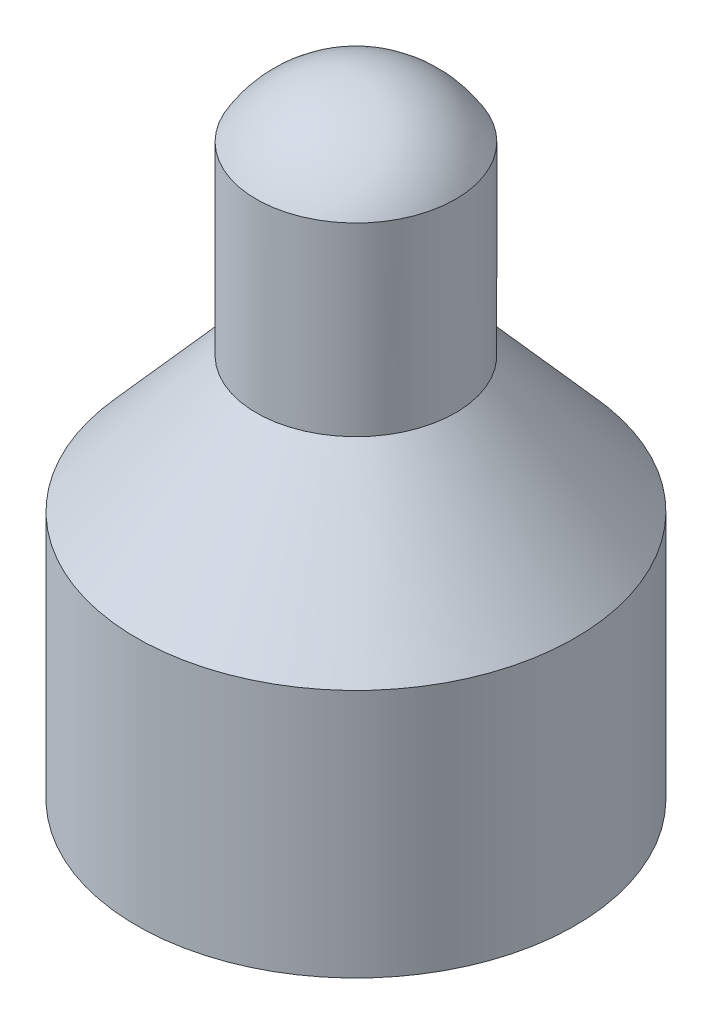
ISO-10303-21;
HEADER;
FILE_DESCRIPTION(('STEP AP214'),'2;1');
FILE_NAME('part.step','',(''),(''),'','','');
FILE_SCHEMA(('AUTOMOTIVE_DESIGN { 1 0 10303 214 1 1 1 1 }'));
ENDSEC;
DATA;
#1=APPLICATION_CONTEXT('core data for automotive mechanical design processes');
#2=APPLICATION_PROTOCOL_DEFINITION('international standard','automotive_design',2000,#1);
#3=PRODUCT_CONTEXT('',#1,'mechanical');
#4=PRODUCT('Part','Part','',(#3));
#5=PRODUCT_RELATED_PRODUCT_CATEGORY('part','',(#4));
#6=PRODUCT_DEFINITION_FORMATION('','',#4);
#7=PRODUCT_DEFINITION_CONTEXT('part definition',#1,'design');
#8=PRODUCT_DEFINITION('design','',#6,#7);
#9=PRODUCT_DEFINITION_SHAPE('','',#8);
#10=(LENGTH_UNIT() NAMED_UNIT(*) SI_UNIT(.MILLI.,.METRE.));
#11=(NAMED_UNIT(*) PLANE_ANGLE_UNIT() SI_UNIT($,.RADIAN.));
#12=(NAMED_UNIT(*) SI_UNIT($,.STERADIAN.) SOLID_ANGLE_UNIT());
#13=UNCERTAINTY_MEASURE_WITH_UNIT(LENGTH_MEASURE(1.E-05),#10,'distance_accuracy_value','');
#14=(GEOMETRIC_REPRESENTATION_CONTEXT(3) GLOBAL_UNCERTAINTY_ASSIGNED_CONTEXT((#13)) GLOBAL_UNIT_ASSIGNED_CONTEXT((#10,
#11,#12)) REPRESENTATION_CONTEXT('',''));
#15=CARTESIAN_POINT('',(0.,0.,0.));
#16=DIRECTION('',(0.,0.,1.));
#17=DIRECTION('',(1.,0.,0.));
#18=AXIS2_PLACEMENT_3D('',#15,#16,#17);
#19=CARTESIAN_POINT('',(0.,0.,0.));
#20=DIRECTION('',(0.,-1.,0.));
#21=DIRECTION('',(0.,0.,-1.));
#22=AXIS2_PLACEMENT_3D('',#19,#20,#21);
#23=CYLINDRICAL_SURFACE('',#22,15.4);
#24=DIRECTION('',(0.,-1.,0.));
#25=VECTOR('',#24,1.);
#26=CARTESIAN_POINT('',(-1.75214154679352,0.,-15.3));
#27=LINE('',#26,#25);
#28=CARTESIAN_POINT('',(-1.75214154679352,6.14474169299556,-15.3));
#29=VERTEX_POINT('',#28);
#30=CARTESIAN_POINT('',(-1.75214154679352,11.8552583070096,-15.3));
#31=VERTEX_POINT('',#30);
#32=EDGE_CURVE('E69',#29,#31,#27,.F.);
#33=ORIENTED_EDGE('',*,*,#32,.F.);
#34=CARTESIAN_POINT('',(1.75214154679352,6.14474169290187,-15.3));
#35=CARTESIAN_POINT('',(1.67314639608,6.09625650883847,-15.3090514272152));
#36=CARTESIAN_POINT('',(1.5920982429523,6.0510437936678,-15.31770833505));
#37=CARTESIAN_POINT('',(1.42644798123138,5.96745316012946,-15.3340188380003));
#38=CARTESIAN_POINT('',(1.34184564701583,5.92907567648062,-15.3416723692932));
#39=CARTESIAN_POINT('',(1.16968719736455,5.85946694420795,-15.3557575356933));
#40=CARTESIAN_POINT('',(1.08213239992014,5.82823255409402,-15.362189707735));
#41=CARTESIAN_POINT('',(0.904676531762246,5.77312772575166,-15.3736621637702));
#42=CARTESIAN_POINT('',(0.814775571528556,5.74925694145039,-15.3787025131749));
#43=CARTESIAN_POINT('',(0.542292573368052,5.68896376781776,-15.3915179820222));
#44=CARTESIAN_POINT('',(0.356944029801289,5.66386605555766,-15.3969863744267));
#45=CARTESIAN_POINT('',(-0.0153140458111716,5.64484939321902,-15.4011189072901));
#46=CARTESIAN_POINT('',(-0.202223395487172,5.65092685004624,-15.3997838318829));
#47=CARTESIAN_POINT('',(-0.570345271653622,5.69376390374091,-15.3905253736287));
#48=CARTESIAN_POINT('',(-0.7515966830631,5.73020621369165,-15.3826701242961));
#49=CARTESIAN_POINT('',(-1.10523677502163,5.83223449343981,-15.3613076537633));
#50=CARTESIAN_POINT('',(-1.27763529295015,5.89778729786998,-15.3478068655014));
#51=CARTESIAN_POINT('',(-1.49616783022504,6.00209199105412,-15.3272421819475));
#52=CARTESIAN_POINT('',(-1.54848053564427,6.0287775784904,-15.3220400066811));
#53=CARTESIAN_POINT('',(-1.65150524964838,6.08478962870734,-15.3112766770243));
#54=CARTESIAN_POINT('',(-1.70222010292205,6.11411099271677,-15.3057162213712));
#55=CARTESIAN_POINT('',(-1.75214154679352,6.14474169299555,-15.3));
#56=B_SPLINE_CURVE_WITH_KNOTS('',3,(#34,#35,#36,#37,#38,#39,#40,#41,#42,#43,#44,#45,#46,#47,#48,
#49,#50,#51,#52,#53,#54,#55),.UNSPECIFIED.,.F.,.F.,(4,2,2,2,2,2,2,2,2,2,4),(0.,
0.279304065473987,0.558625888271458,0.837824629735383,1.11701024749008,1.67542509611906,
2.23377558608882,2.78636389958621,3.33832426211491,3.51513482469676,3.69161042902847),.UNSPECIFIED.);
#57=CARTESIAN_POINT('',(1.75214154679352,6.14474169290187,-15.3));
#58=VERTEX_POINT('',#57);
#59=EDGE_CURVE('E11',#58,#29,#56,.T.);
#60=ORIENTED_EDGE('',*,*,#59,.F.);
#61=DIRECTION('',(0.,-1.,0.));
#62=VECTOR('',#61,1.);
#63=CARTESIAN_POINT('',(1.75214154679352,0.,-15.3));
#64=LINE('',#63,#62);
#65=CARTESIAN_POINT('',(1.75214154679352,11.8552583071033,-15.3));
#66=VERTEX_POINT('',#65);
#67=EDGE_CURVE('E59',#66,#58,#64,.T.);
#68=ORIENTED_EDGE('',*,*,#67,.F.);
#69=CARTESIAN_POINT('',(-1.75214154679352,11.8552583070096,-15.3));
#70=CARTESIAN_POINT('',(-1.67314639608246,11.9037434910773,-15.3090514272149));
#71=CARTESIAN_POINT('',(-1.59209824295704,11.9489562062523,-15.3177083350495));
#72=CARTESIAN_POINT('',(-1.42644798124032,12.0325468397997,-15.3340188379994));
#73=CARTESIAN_POINT('',(-1.34184564702669,12.070924323453,-15.3416723692922));
#74=CARTESIAN_POINT('',(-1.16968719737885,12.140533055735,-15.3557575356922));
#75=CARTESIAN_POINT('',(-1.08213239993596,12.1717674458536,-15.3621897077339));
#76=CARTESIAN_POINT('',(-0.904676531780734,12.2268722742055,-15.3736621637691));
#77=CARTESIAN_POINT('',(-0.81477557154818,12.2507430585115,-15.3787025131739));
#78=CARTESIAN_POINT('',(-0.542292573390473,12.3110362321587,-15.3915179820214));
#79=CARTESIAN_POINT('',(-0.356944029824768,12.3361339444286,-15.3969863744261));
#80=CARTESIAN_POINT('',(0.0153140457872339,12.3551506067869,-15.4011189072902));
#81=CARTESIAN_POINT('',(0.202223395463833,12.3490731499695,-15.3997838318833));
#82=CARTESIAN_POINT('',(0.5703452716329,12.3062360962941,-15.3905253736294));
#83=CARTESIAN_POINT('',(0.751596683044384,12.2697937863529,-15.3826701242971));
#84=CARTESIAN_POINT('',(1.10523677500842,12.1677655066232,-15.3613076537642));
#85=CARTESIAN_POINT('',(1.27763529294045,12.102212702202,-15.3478068655023));
#86=CARTESIAN_POINT('',(1.49616783022028,11.9979080090296,-15.327242181948));
#87=CARTESIAN_POINT('',(1.54848053564034,11.9712224215963,-15.3220400066815));
#88=CARTESIAN_POINT('',(1.65150524964629,11.9152103713855,-15.3112766770245));
#89=CARTESIAN_POINT('',(1.70222010292096,11.885889007379,-15.3057162213713));
#90=CARTESIAN_POINT('',(1.75214154679352,11.8552583071033,-15.3));
#91=B_SPLINE_CURVE_WITH_KNOTS('',3,(#69,#70,#71,#72,#73,#74,#75,#76,#77,#78,#79,#80,#81,#82,#83,
#84,#85,#86,#87,#88,#89,#90),.UNSPECIFIED.,.F.,.F.,(4,2,2,2,2,2,2,2,2,2,4),(0.,
0.279304065474378,0.55862588827224,0.83782462973658,1.11701024749169,1.6754250961215,
2.23377558609208,2.78636389958973,3.33832426211868,3.51513482469863,3.69161042902846),.UNSPECIFIED.);
#92=EDGE_CURVE('E47',#31,#66,#91,.T.);
#93=ORIENTED_EDGE('',*,*,#92,.F.);
#94=EDGE_LOOP('',(#33,#60,#68,#93));
#95=FACE_BOUND('',#94,.T.);
#96=CARTESIAN_POINT('',(0.,17.5,0.));
#97=DIRECTION('',(0.,-1.,0.));
#98=DIRECTION('',(0.,0.,-1.));
#99=AXIS2_PLACEMENT_3D('',#96,#97,#98);
#100=CIRCLE('',#99,15.4);
#101=CARTESIAN_POINT('',(0.,17.5,-15.4));
#102=VERTEX_POINT('',#101);
#103=EDGE_CURVE('E71',#102,#102,#100,.T.);
#104=ORIENTED_EDGE('',*,*,#103,.T.);
#105=EDGE_LOOP('',(#104));
#106=FACE_BOUND('',#105,.T.);
#107=CARTESIAN_POINT('',(0.,0.,0.));
#108=DIRECTION('',(0.,-1.,0.));
#109=DIRECTION('',(0.,0.,-1.));
#110=AXIS2_PLACEMENT_3D('',#107,#108,#109);
#111=CIRCLE('',#110,15.4);
#112=CARTESIAN_POINT('',(0.,0.,-15.4));
#113=VERTEX_POINT('',#112);
#114=EDGE_CURVE('E84',#113,#113,#111,.T.);
#115=ORIENTED_EDGE('',*,*,#114,.F.);
#116=EDGE_LOOP('',(#115));
#117=FACE_BOUND('',#116,.T.);
#118=ADVANCED_FACE('F35',(#95,#106,#117),#23,.T.);
#119=CARTESIAN_POINT('',(0.,17.5,0.));
#120=DIRECTION('',(0.,-1.,0.));
#121=DIRECTION('',(0.,0.,-1.));
#122=AXIS2_PLACEMENT_3D('',#119,#120,#121);
#123=CONICAL_SURFACE('',#122,15.4,0.724022831283632);
#124=CARTESIAN_POINT('',(0.,27.,0.));
#125=DIRECTION('',(0.,-1.,0.));
#126=DIRECTION('',(0.,0.,-1.));
#127=AXIS2_PLACEMENT_3D('',#124,#125,#126);
#128=CIRCLE('',#127,7.);
#129=CARTESIAN_POINT('',(0.,27.,-7.));
#130=VERTEX_POINT('',#129);
#131=EDGE_CURVE('E102',#130,#130,#128,.T.);
#132=ORIENTED_EDGE('',*,*,#131,.T.);
#133=EDGE_LOOP('',(#132));
#134=FACE_BOUND('',#133,.T.);
#135=ORIENTED_EDGE('',*,*,#103,.F.);
#136=EDGE_LOOP('',(#135));
#137=FACE_BOUND('',#136,.T.);
#138=ADVANCED_FACE('F133',(#134,#137),#123,.T.);
#139=CARTESIAN_POINT('',(0.,0.,0.));
#140=DIRECTION('',(0.,-1.,0.));
#141=DIRECTION('',(0.,0.,-1.));
#142=AXIS2_PLACEMENT_3D('',#139,#140,#141);
#143=CYLINDRICAL_SURFACE('',#142,7.);
#144=CARTESIAN_POINT('',(0.,40.,0.));
#145=DIRECTION('',(0.,-1.,0.));
#146=DIRECTION('',(0.,0.,-1.));
#147=AXIS2_PLACEMENT_3D('',#144,#145,#146);
#148=CIRCLE('',#147,7.);
#149=CARTESIAN_POINT('',(0.,40.,-7.));
#150=VERTEX_POINT('',#149);
#151=EDGE_CURVE('E99',#150,#150,#148,.T.);
#152=ORIENTED_EDGE('',*,*,#151,.T.);
#153=EDGE_LOOP('',(#152));
#154=FACE_BOUND('',#153,.T.);
#155=ORIENTED_EDGE('',*,*,#131,.F.);
#156=EDGE_LOOP('',(#155));
#157=FACE_BOUND('',#156,.T.);
#158=ADVANCED_FACE('F137',(#154,#157),#143,.T.);
#159=CARTESIAN_POINT('',(0.,35.875,0.));
#160=DIRECTION('',(0.,-1.,0.));
#161=DIRECTION('',(1.,0.,0.));
#162=AXIS2_PLACEMENT_3D('',#159,#160,#161);
#163=SPHERICAL_SURFACE('',#162,8.12500000000001);
#164=ORIENTED_EDGE('',*,*,#151,.F.);
#165=EDGE_LOOP('',(#164));
#166=FACE_BOUND('',#165,.T.);
#167=ADVANCED_FACE('F142',(#166),#163,.T.);
#168=CARTESIAN_POINT('',(5.44315789473684,24.,0.));
#169=DIRECTION('',(0.,-1.,0.));
#170=DIRECTION('',(0.,0.,-1.));
#171=AXIS2_PLACEMENT_3D('',#168,#169,#170);
#172=PLANE('',#171);
#173=CARTESIAN_POINT('',(0.,24.,0.));
#174=DIRECTION('',(0.,-1.,0.));
#175=DIRECTION('',(0.,0.,-1.));
#176=AXIS2_PLACEMENT_3D('',#173,#174,#175);
#177=CIRCLE('',#176,5.44315789473684);
#178=CARTESIAN_POINT('',(0.,24.,-5.44315789473684));
#179=VERTEX_POINT('',#178);
#180=EDGE_CURVE('E96',#179,#179,#177,.T.);
#181=ORIENTED_EDGE('',*,*,#180,.T.);
#182=EDGE_LOOP('',(#181));
#183=FACE_BOUND('',#182,.T.);
#184=ADVANCED_FACE('F149',(#183),#172,.T.);
#185=CARTESIAN_POINT('',(0.,24.,0.));
#186=DIRECTION('',(0.,-1.,0.));
#187=DIRECTION('',(0.,0.,-1.));
#188=AXIS2_PLACEMENT_3D('',#185,#186,#187);
#189=CONICAL_SURFACE('',#188,5.44315789473684,0.724022831283632);
#190=CARTESIAN_POINT('',(0.,17.15,0.));
#191=DIRECTION('',(0.,-1.,0.));
#192=DIRECTION('',(0.,0.,-1.));
#193=AXIS2_PLACEMENT_3D('',#190,#191,#192);
#194=CIRCLE('',#193,11.5);
#195=CARTESIAN_POINT('',(0.,17.15,-11.5));
#196=VERTEX_POINT('',#195);
#197=EDGE_CURVE('E93',#196,#196,#194,.T.);
#198=ORIENTED_EDGE('',*,*,#197,.T.);
#199=EDGE_LOOP('',(#198));
#200=FACE_BOUND('',#199,.T.);
#201=ORIENTED_EDGE('',*,*,#180,.F.);
#202=EDGE_LOOP('',(#201));
#203=FACE_BOUND('',#202,.T.);
#204=ADVANCED_FACE('F153',(#200,#203),#189,.F.);
#205=CARTESIAN_POINT('',(12.5,17.15,0.));
#206=DIRECTION('',(0.,-1.,0.));
#207=DIRECTION('',(0.,0.,-1.));
#208=AXIS2_PLACEMENT_3D('',#205,#206,#207);
#209=PLANE('',#208);
#210=CARTESIAN_POINT('',(0.,17.15,0.));
#211=DIRECTION('',(0.,-1.,0.));
#212=DIRECTION('',(0.,0.,-1.));
#213=AXIS2_PLACEMENT_3D('',#210,#211,#212);
#214=CIRCLE('',#213,12.5);
#215=CARTESIAN_POINT('',(0.,17.15,-12.5));
#216=VERTEX_POINT('',#215);
#217=EDGE_CURVE('E90',#216,#216,#214,.T.);
#218=ORIENTED_EDGE('',*,*,#217,.T.);
#219=EDGE_LOOP('',(#218));
#220=FACE_BOUND('',#219,.T.);
#221=ORIENTED_EDGE('',*,*,#197,.F.);
#222=EDGE_LOOP('',(#221));
#223=FACE_BOUND('',#222,.T.);
#224=ADVANCED_FACE('F129',(#220,#223),#209,.T.);
#225=CARTESIAN_POINT('',(0.,0.,0.));
#226=DIRECTION('',(0.,-1.,0.));
#227=DIRECTION('',(0.,0.,-1.));
#228=AXIS2_PLACEMENT_3D('',#225,#226,#227);
#229=CYLINDRICAL_SURFACE('',#228,12.5);
#230=CARTESIAN_POINT('',(0.,10.65,-12.5));
#231=CARTESIAN_POINT('',(-0.0922509659142323,10.649996108493,-12.4999986553884));
#232=CARTESIAN_POINT('',(-0.184558502715377,10.6422373229056,-12.498968007311));
#233=CARTESIAN_POINT('',(-0.366601950920957,10.6114101965439,-12.4949556982822));
#234=CARTESIAN_POINT('',(-0.4563351259759,10.5883261525009,-12.4919720361882));
#235=CARTESIAN_POINT('',(-0.630568283941343,10.5275430658043,-12.4843896079466));
#236=CARTESIAN_POINT('',(-0.71507185631948,10.4898541795178,-12.4797919643879));
#237=CARTESIAN_POINT('',(-0.876539590939074,10.4009541850338,-12.4694920533569));
#238=CARTESIAN_POINT('',(-0.953504978702876,10.3497452798764,-12.4637899658902));
#239=CARTESIAN_POINT('',(-1.09819718658205,10.2349246162499,-12.4518781663594));
#240=CARTESIAN_POINT('',(-1.1658712816474,10.1712466789113,-12.4456658531834));
#241=CARTESIAN_POINT('',(-1.28960557413889,10.0334377453889,-12.4334545778039));
#242=CARTESIAN_POINT('',(-1.34566516063208,9.95930619968091,-12.4274556268374));
#243=CARTESIAN_POINT('',(-1.44477796066646,9.80234850634939,-12.4163248280925));
#244=CARTESIAN_POINT('',(-1.48778133107337,9.71949062622575,-12.4111963353939));
#245=CARTESIAN_POINT('',(-1.55924262980494,9.54764984819382,-12.4024218004722));
#246=CARTESIAN_POINT('',(-1.58770117215908,9.45866720903046,-12.3987756956693));
#247=CARTESIAN_POINT('',(-1.62910377910463,9.27765215109019,-12.3934038347284));
#248=CARTESIAN_POINT('',(-1.64213723047393,9.18564051128433,-12.3916670186782));
#249=CARTESIAN_POINT('',(-1.6525963615546,9.00072085172764,-12.3902766213381));
#250=CARTESIAN_POINT('',(-1.65002273886784,8.90781287222655,-12.3906229469364));
#251=CARTESIAN_POINT('',(-1.6294140660036,8.72436300913982,-12.3933495814873));
#252=CARTESIAN_POINT('',(-1.61147776254765,8.63380981177389,-12.395716899785));
#253=CARTESIAN_POINT('',(-1.56080707632498,8.45700984248315,-12.4021985149079));
#254=CARTESIAN_POINT('',(-1.52807236230629,8.3707631670048,-12.4063128508388));
#255=CARTESIAN_POINT('',(-1.44862884068035,8.20471936029679,-12.4158395520745));
#256=CARTESIAN_POINT('',(-1.40187740731702,8.12494285916717,-12.4212558666767));
#257=CARTESIAN_POINT('',(-1.29575800474392,7.97433012632288,-12.4327732471151));
#258=CARTESIAN_POINT('',(-1.23638939245273,7.90349435059895,-12.4388743478466));
#259=CARTESIAN_POINT('',(-1.10617499798151,7.77220089876072,-12.4511315214541));
#260=CARTESIAN_POINT('',(-1.03524415653744,7.711827556525,-12.4572876551223));
#261=CARTESIAN_POINT('',(-0.884210857811213,7.6038303550122,-12.4689172796715));
#262=CARTESIAN_POINT('',(-0.804108375018418,7.55620653119872,-12.4743907686536));
#263=CARTESIAN_POINT('',(-0.636938460986385,7.4750590553997,-12.484042355461));
#264=CARTESIAN_POINT('',(-0.549868279152675,7.44154100486732,-12.4882199385046));
#265=CARTESIAN_POINT('',(-0.371267976474138,7.38962514043487,-12.4948044580827));
#266=CARTESIAN_POINT('',(-0.279738088894882,7.3712265366073,-12.4972114871206));
#267=CARTESIAN_POINT('',(-0.0955454110605677,7.35018188030885,-12.4999716099048));
#268=CARTESIAN_POINT('',(-0.00289610511857329,7.34741971549103,-12.5003398427993));
#269=CARTESIAN_POINT('',(0.181544148381852,7.35741945737864,-12.4990218465851));
#270=CARTESIAN_POINT('',(0.273335116324652,7.37018099446876,-12.4973356663916));
#271=CARTESIAN_POINT('',(0.453108088985705,7.4107693973755,-12.4921077115532));
#272=CARTESIAN_POINT('',(0.541102881534319,7.43854058262761,-12.4885727966281));
#273=CARTESIAN_POINT('',(0.711186579168435,7.50830185401686,-12.4800429260914));
#274=CARTESIAN_POINT('',(0.793275262802481,7.55029247297971,-12.4750479157687));
#275=CARTESIAN_POINT('',(0.949733027407938,7.64757933992223,-12.4641165128389));
#276=CARTESIAN_POINT('',(1.02405527014396,7.70295031675022,-12.4581748993319));
#277=CARTESIAN_POINT('',(1.16239311646149,7.82532084440561,-12.4460304374708));
#278=CARTESIAN_POINT('',(1.22640826160188,7.89232091219872,-12.4398275775125));
#279=CARTESIAN_POINT('',(1.34272949930146,8.03656066939668,-12.427812668937));
#280=CARTESIAN_POINT('',(1.39495839046207,8.11386287942388,-12.422003362126));
#281=CARTESIAN_POINT('',(1.48569034045958,8.27621075919613,-12.4114793355964));
#282=CARTESIAN_POINT('',(1.52419370073337,8.36125625883336,-12.40676459184));
#283=CARTESIAN_POINT('',(1.58625802021031,8.5364324575978,-12.3989825257156));
#284=CARTESIAN_POINT('',(1.60986174308102,8.62654778742277,-12.395910492496));
#285=CARTESIAN_POINT('',(1.64159408961649,8.80950632144843,-12.3917484325846));
#286=CARTESIAN_POINT('',(1.64972352322195,8.90234938261848,-12.390658302158));
#287=CARTESIAN_POINT('',(1.65026050729394,9.08735951859218,-12.3905867313463));
#288=CARTESIAN_POINT('',(1.6427893634322,9.17952625838098,-12.3915890208826));
#289=CARTESIAN_POINT('',(1.61259495475241,9.36128141623128,-12.3955542787341));
#290=CARTESIAN_POINT('',(1.58987169439037,9.45086983504605,-12.3985172464765));
#291=CARTESIAN_POINT('',(1.52985734760344,9.62490463279792,-12.4060648042427));
#292=CARTESIAN_POINT('',(1.49257280459361,9.7093533017143,-12.4106486657967));
#293=CARTESIAN_POINT('',(1.40450618423476,9.87081546538517,-12.4209226365687));
#294=CARTESIAN_POINT('',(1.35372386121888,9.94782882477825,-12.4266127659209));
#295=CARTESIAN_POINT('',(1.23965546715595,10.0928534458449,-12.4385110765891));
#296=CARTESIAN_POINT('',(1.17627910409951,10.1607934040608,-12.4447228000133));
#297=CARTESIAN_POINT('',(1.03901112502639,10.2851193500531,-12.4569335544568));
#298=CARTESIAN_POINT('',(0.96511704377438,10.3415026214902,-12.4629325351987));
#299=CARTESIAN_POINT('',(0.808549280168614,10.4413211149838,-12.4740702486112));
#300=CARTESIAN_POINT('',(0.725839748433107,10.4847005022019,-12.4792052313115));
#301=CARTESIAN_POINT('',(0.554286102127642,10.5568908306887,-12.4879988146703));
#302=CARTESIAN_POINT('',(0.465448689177245,10.58571740896,-12.4916589991428));
#303=CARTESIAN_POINT('',(0.313472456145789,10.6211773438647,-12.4962204250721));
#304=CARTESIAN_POINT('',(0.251287086879961,10.6319700524388,-12.4976307637456));
#305=CARTESIAN_POINT('',(0.126076615825898,10.6463826796329,-12.4995210067266));
#306=CARTESIAN_POINT('',(0.0630515212430904,10.6500026597601,-12.5000009190127));
#307=CARTESIAN_POINT('',(0.,10.65,-12.5));
#308=B_SPLINE_CURVE_WITH_KNOTS('',3,(#230,#231,#232,#233,#234,#235,#236,#237,#238,#239,#240,
#241,#242,#243,#244,#245,#246,#247,#248,#249,#250,#251,#252,#253,#254,#255,#256,#257,#258,#259,
#260,#261,#262,#263,#264,#265,#266,#267,#268,#269,#270,#271,#272,#273,#274,#275,#276,#277,#278,
#279,#280,#281,#282,#283,#284,#285,#286,#287,#288,#289,#290,#291,#292,#293,#294,#295,#296,#297,
#298,#299,#300,#301,#302,#303,#304,#305,#306,#307),.UNSPECIFIED.,.T.,.F.,(4,2,2,2,2,2,2,2,2,2,2,
2,2,2,2,2,2,2,2,2,2,2,2,2,2,2,2,2,2,2,2,2,2,2,2,2,2,2,4),(0.,0.27652256759341,0.553328916636196,
0.829943115961213,1.106512269752,1.38459116209452,1.66268467791007,1.94182686179847,
2.22095726035026,2.49846208170458,2.77595449929574,3.05167655007195,3.32740477299745,
3.60398015842833,3.88056964393413,4.159294237539,4.43801960642627,4.71685555395558,
4.99567693255305,5.27242510869489,5.5491666956633,5.82488864439133,6.10062092602062,
6.37793027840446,6.65525196160273,6.93434056471004,7.21342303816142,7.49170082672567,
7.76996404953484,8.04607163604137,8.3221791418815,8.59816271557356,8.87415131265901,
9.15219502941573,9.43030402415318,9.70959057439001,9.98857638890452,10.1775751477029,
10.3665722858035),.UNSPECIFIED.);
#309=CARTESIAN_POINT('',(0.,10.65,-12.5));
#310=VERTEX_POINT('',#309);
#311=EDGE_CURVE('E75',#310,#310,#308,.T.);
#312=ORIENTED_EDGE('',*,*,#311,.F.);
#313=EDGE_LOOP('',(#312));
#314=FACE_BOUND('',#313,.T.);
#315=CARTESIAN_POINT('',(0.,0.,0.));
#316=DIRECTION('',(0.,-1.,0.));
#317=DIRECTION('',(0.,0.,-1.));
#318=AXIS2_PLACEMENT_3D('',#315,#316,#317);
#319=CIRCLE('',#318,12.5);
#320=CARTESIAN_POINT('',(0.,0.,-12.5));
#321=VERTEX_POINT('',#320);
#322=EDGE_CURVE('E87',#321,#321,#319,.T.);
#323=ORIENTED_EDGE('',*,*,#322,.T.);
#324=EDGE_LOOP('',(#323));
#325=FACE_BOUND('',#324,.T.);
#326=ORIENTED_EDGE('',*,*,#217,.F.);
#327=EDGE_LOOP('',(#326));
#328=FACE_BOUND('',#327,.T.);
#329=ADVANCED_FACE('F112',(#314,#325,#328),#229,.F.);
#330=CARTESIAN_POINT('',(12.5,0.,0.));
#331=DIRECTION('',(0.,-1.,0.));
#332=DIRECTION('',(0.,0.,-1.));
#333=AXIS2_PLACEMENT_3D('',#330,#331,#332);
#334=PLANE('',#333);
#335=ORIENTED_EDGE('',*,*,#114,.T.);
#336=EDGE_LOOP('',(#335));
#337=FACE_BOUND('',#336,.T.);
#338=ORIENTED_EDGE('',*,*,#322,.F.);
#339=EDGE_LOOP('',(#338));
#340=FACE_BOUND('',#339,.T.);
#341=ADVANCED_FACE('F120',(#337,#340),#334,.T.);
#342=CARTESIAN_POINT('',(0.,9.,-15.4));
#343=DIRECTION('',(0.,0.,1.));
#344=DIRECTION('',(1.,0.,0.));
#345=AXIS2_PLACEMENT_3D('',#342,#343,#344);
#346=CYLINDRICAL_SURFACE('',#345,1.65);
#347=CARTESIAN_POINT('',(0.,9.,-15.3));
#348=DIRECTION('',(0.,0.,1.));
#349=DIRECTION('',(1.,0.,0.));
#350=AXIS2_PLACEMENT_3D('',#347,#348,#349);
#351=CIRCLE('',#350,1.65);
#352=CARTESIAN_POINT('',(1.65,9.,-15.3));
#353=VERTEX_POINT('',#352);
#354=EDGE_CURVE('E78',#353,#353,#351,.F.);
#355=ORIENTED_EDGE('',*,*,#354,.T.);
#356=EDGE_LOOP('',(#355));
#357=FACE_BOUND('',#356,.T.);
#358=ORIENTED_EDGE('',*,*,#311,.T.);
#359=EDGE_LOOP('',(#358));
#360=FACE_BOUND('',#359,.T.);
#361=ADVANCED_FACE('F116',(#357,#360),#346,.F.);
#362=CARTESIAN_POINT('',(7.63382412838354E-11,9.00000000000256,-15.4));
#363=DIRECTION('',(0.,0.,1.));
#364=DIRECTION('',(1.,0.,0.));
#365=AXIS2_PLACEMENT_3D('',#362,#363,#364);
#366=CYLINDRICAL_SURFACE('',#365,3.35);
#367=ORIENTED_EDGE('',*,*,#59,.T.);
#368=CARTESIAN_POINT('',(7.63382412838354E-11,9.00000000000256,-15.3));
#369=DIRECTION('',(0.,0.,1.));
#370=DIRECTION('',(1.,0.,0.));
#371=AXIS2_PLACEMENT_3D('',#368,#369,#370);
#372=CIRCLE('',#371,3.35);
#373=EDGE_CURVE('E74',#29,#58,#372,.T.);
#374=ORIENTED_EDGE('',*,*,#373,.T.);
#375=EDGE_LOOP('',(#367,#374));
#376=FACE_BOUND('',#375,.T.);
#377=ADVANCED_FACE('F119',(#376),#366,.F.);
#378=CARTESIAN_POINT('',(7.63382412838354E-11,9.00000000000256,-15.3));
#379=DIRECTION('',(0.,0.,1.));
#380=DIRECTION('',(1.,0.,0.));
#381=AXIS2_PLACEMENT_3D('',#378,#379,#380);
#382=PLANE('',#381);
#383=ORIENTED_EDGE('',*,*,#32,.T.);
#384=EDGE_CURVE('E54',#66,#31,#372,.T.);
#385=ORIENTED_EDGE('',*,*,#384,.F.);
#386=ORIENTED_EDGE('',*,*,#67,.T.);
#387=ORIENTED_EDGE('',*,*,#373,.F.);
#388=EDGE_LOOP('',(#383,#385,#386,#387));
#389=FACE_BOUND('',#388,.T.);
#390=ORIENTED_EDGE('',*,*,#354,.F.);
#391=EDGE_LOOP('',(#390));
#392=FACE_BOUND('',#391,.T.);
#393=ADVANCED_FACE('F72',(#389,#392),#382,.F.);
#394=ORIENTED_EDGE('',*,*,#384,.T.);
#395=ORIENTED_EDGE('',*,*,#92,.T.);
#396=EDGE_LOOP('',(#394,#395));
#397=FACE_BOUND('',#396,.T.);
#398=ADVANCED_FACE('F77',(#397),#366,.F.);
#399=CLOSED_SHELL('',(#118,#138,#158,#167,#184,#204,#224,#329,#341,#361,#377,#393,#398));
#400=MANIFOLD_SOLID_BREP('B2',#399);
#401=ADVANCED_BREP_SHAPE_REPRESENTATION('',(#18,#400),#14);
#402=SHAPE_DEFINITION_REPRESENTATION(#9,#401);
ENDSEC;
END-ISO-10303-21;
